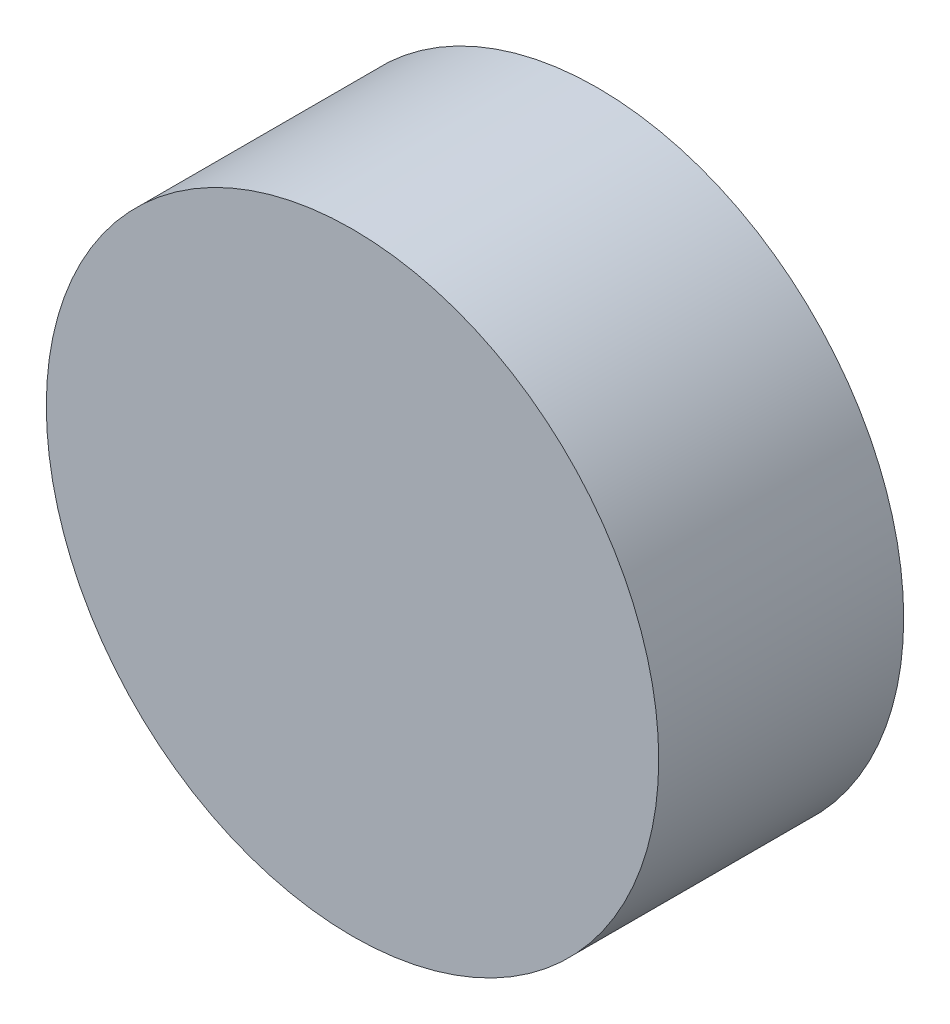
ISO-10303-21;
HEADER;
FILE_DESCRIPTION(('STEP AP214'),'2;1');
FILE_NAME('part.step','',(''),(''),'','','');
FILE_SCHEMA(('AUTOMOTIVE_DESIGN { 1 0 10303 214 1 1 1 1 }'));
ENDSEC;
DATA;
#1=APPLICATION_CONTEXT('core data for automotive mechanical design processes');
#2=APPLICATION_PROTOCOL_DEFINITION('international standard','automotive_design',2000,#1);
#3=PRODUCT_CONTEXT('',#1,'mechanical');
#4=PRODUCT('Part','Part','',(#3));
#5=PRODUCT_RELATED_PRODUCT_CATEGORY('part','',(#4));
#6=PRODUCT_DEFINITION_FORMATION('','',#4);
#7=PRODUCT_DEFINITION_CONTEXT('part definition',#1,'design');
#8=PRODUCT_DEFINITION('design','',#6,#7);
#9=PRODUCT_DEFINITION_SHAPE('','',#8);
#10=(LENGTH_UNIT() NAMED_UNIT(*) SI_UNIT(.MILLI.,.METRE.));
#11=(NAMED_UNIT(*) PLANE_ANGLE_UNIT() SI_UNIT($,.RADIAN.));
#12=(NAMED_UNIT(*) SI_UNIT($,.STERADIAN.) SOLID_ANGLE_UNIT());
#13=UNCERTAINTY_MEASURE_WITH_UNIT(LENGTH_MEASURE(1.E-05),#10,'distance_accuracy_value','');
#14=(GEOMETRIC_REPRESENTATION_CONTEXT(3) GLOBAL_UNCERTAINTY_ASSIGNED_CONTEXT((#13)) GLOBAL_UNIT_ASSIGNED_CONTEXT((#10,
#11,#12)) REPRESENTATION_CONTEXT('',''));
#15=CARTESIAN_POINT('',(0.,0.,0.));
#16=DIRECTION('',(0.,0.,1.));
#17=DIRECTION('',(1.,0.,0.));
#18=AXIS2_PLACEMENT_3D('',#15,#16,#17);
#19=CARTESIAN_POINT('',(0.,0.,8.));
#20=DIRECTION('',(0.,0.,-1.));
#21=DIRECTION('',(-1.,0.,0.));
#22=AXIS2_PLACEMENT_3D('',#19,#20,#21);
#23=CYLINDRICAL_SURFACE('',#22,10.);
#24=CARTESIAN_POINT('',(0.,0.,8.));
#25=DIRECTION('',(0.,0.,1.));
#26=DIRECTION('',(1.,0.,0.));
#27=AXIS2_PLACEMENT_3D('',#24,#25,#26);
#28=CIRCLE('',#27,10.);
#29=CARTESIAN_POINT('',(10.,0.,8.));
#30=VERTEX_POINT('',#29);
#31=EDGE_CURVE('E10',#30,#30,#28,.T.);
#32=ORIENTED_EDGE('',*,*,#31,.F.);
#33=EDGE_LOOP('',(#32));
#34=FACE_BOUND('',#33,.T.);
#35=CARTESIAN_POINT('',(0.,0.,0.));
#36=DIRECTION('',(0.,0.,1.));
#37=DIRECTION('',(1.,0.,0.));
#38=AXIS2_PLACEMENT_3D('',#35,#36,#37);
#39=CIRCLE('',#38,10.);
#40=CARTESIAN_POINT('',(10.,0.,0.));
#41=VERTEX_POINT('',#40);
#42=EDGE_CURVE('E38',#41,#41,#39,.T.);
#43=ORIENTED_EDGE('',*,*,#42,.T.);
#44=EDGE_LOOP('',(#43));
#45=FACE_BOUND('',#44,.T.);
#46=ADVANCED_FACE('F35',(#34,#45),#23,.T.);
#47=CARTESIAN_POINT('',(0.,0.,8.));
#48=DIRECTION('',(0.,0.,1.));
#49=DIRECTION('',(1.,0.,0.));
#50=AXIS2_PLACEMENT_3D('',#47,#48,#49);
#51=PLANE('',#50);
#52=ORIENTED_EDGE('',*,*,#31,.T.);
#53=EDGE_LOOP('',(#52));
#54=FACE_BOUND('',#53,.T.);
#55=ADVANCED_FACE('F50',(#54),#51,.T.);
#56=CARTESIAN_POINT('',(0.,0.,0.));
#57=DIRECTION('',(0.,0.,1.));
#58=DIRECTION('',(1.,0.,0.));
#59=AXIS2_PLACEMENT_3D('',#56,#57,#58);
#60=PLANE('',#59);
#61=ORIENTED_EDGE('',*,*,#42,.F.);
#62=EDGE_LOOP('',(#61));
#63=FACE_BOUND('',#62,.T.);
#64=ADVANCED_FACE('F48',(#63),#60,.F.);
#65=CLOSED_SHELL('',(#46,#55,#64));
#66=MANIFOLD_SOLID_BREP('B2',#65);
#67=ADVANCED_BREP_SHAPE_REPRESENTATION('',(#18,#66),#14);
#68=SHAPE_DEFINITION_REPRESENTATION(#9,#67);
ENDSEC;
END-ISO-10303-21;
